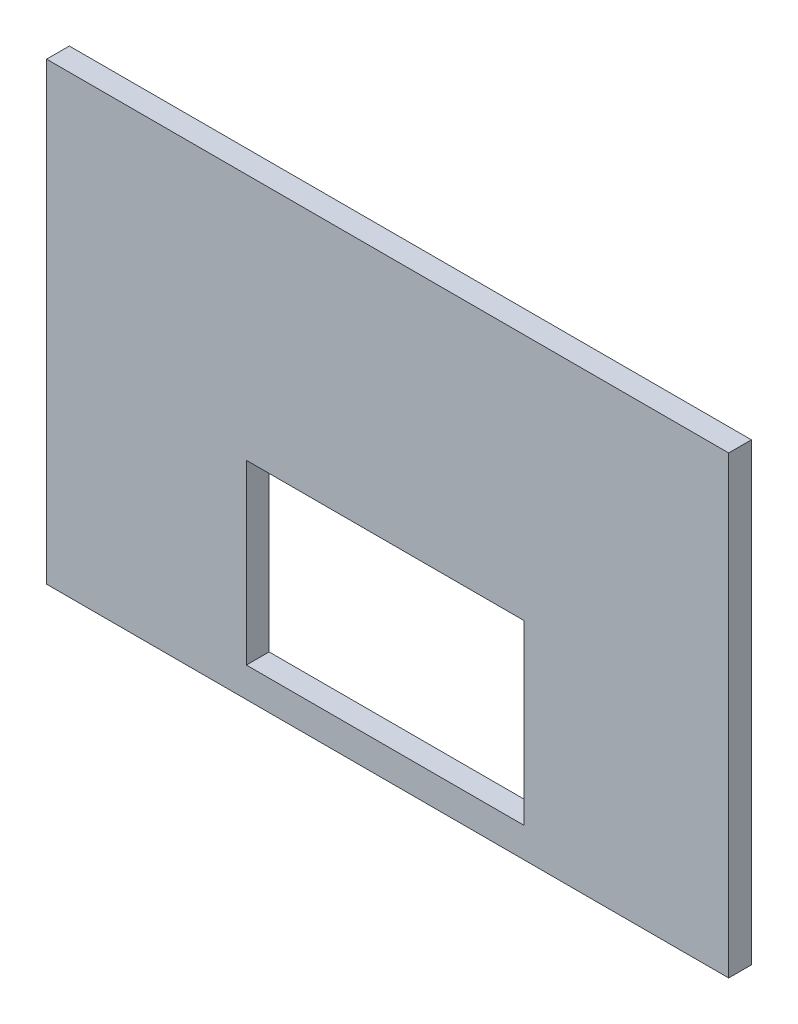
ISO-10303-21;
HEADER;
FILE_DESCRIPTION(('STEP AP214'),'2;1');
FILE_NAME('part.step','',(''),(''),'','','');
FILE_SCHEMA(('AUTOMOTIVE_DESIGN { 1 0 10303 214 1 1 1 1 }'));
ENDSEC;
DATA;
#1=APPLICATION_CONTEXT('core data for automotive mechanical design processes');
#2=APPLICATION_PROTOCOL_DEFINITION('international standard','automotive_design',2000,#1);
#3=PRODUCT_CONTEXT('',#1,'mechanical');
#4=PRODUCT('Part','Part','',(#3));
#5=PRODUCT_RELATED_PRODUCT_CATEGORY('part','',(#4));
#6=PRODUCT_DEFINITION_FORMATION('','',#4);
#7=PRODUCT_DEFINITION_CONTEXT('part definition',#1,'design');
#8=PRODUCT_DEFINITION('design','',#6,#7);
#9=PRODUCT_DEFINITION_SHAPE('','',#8);
#10=(LENGTH_UNIT() NAMED_UNIT(*) SI_UNIT(.MILLI.,.METRE.));
#11=(NAMED_UNIT(*) PLANE_ANGLE_UNIT() SI_UNIT($,.RADIAN.));
#12=(NAMED_UNIT(*) SI_UNIT($,.STERADIAN.) SOLID_ANGLE_UNIT());
#13=UNCERTAINTY_MEASURE_WITH_UNIT(LENGTH_MEASURE(1.E-05),#10,'distance_accuracy_value','');
#14=(GEOMETRIC_REPRESENTATION_CONTEXT(3) GLOBAL_UNCERTAINTY_ASSIGNED_CONTEXT((#13)) GLOBAL_UNIT_ASSIGNED_CONTEXT((#10,
#11,#12)) REPRESENTATION_CONTEXT('',''));
#15=CARTESIAN_POINT('',(0.,0.,0.));
#16=DIRECTION('',(0.,0.,1.));
#17=DIRECTION('',(1.,0.,0.));
#18=AXIS2_PLACEMENT_3D('',#15,#16,#17);
#19=CARTESIAN_POINT('',(0.,0.,10.));
#20=DIRECTION('',(0.,0.,-1.));
#21=DIRECTION('',(-1.,0.,0.));
#22=AXIS2_PLACEMENT_3D('',#19,#20,#21);
#23=PLANE('',#22);
#24=DIRECTION('',(0.,-1.,0.));
#25=VECTOR('',#24,1.);
#26=CARTESIAN_POINT('',(-54.4303797468355,-68.6708860759494,10.));
#27=LINE('',#26,#25);
#28=CARTESIAN_POINT('',(-54.4303797468355,131.329113924051,10.));
#29=VERTEX_POINT('',#28);
#30=CARTESIAN_POINT('',(-54.4303797468355,-68.6708860759494,10.));
#31=VERTEX_POINT('',#30);
#32=EDGE_CURVE('E159',#29,#31,#27,.T.);
#33=ORIENTED_EDGE('',*,*,#32,.T.);
#34=DIRECTION('',(1.,0.,0.));
#35=VECTOR('',#34,1.);
#36=CARTESIAN_POINT('',(-54.4303797468355,-68.6708860759494,10.));
#37=LINE('',#36,#35);
#38=CARTESIAN_POINT('',(245.569620253165,-68.6708860759494,10.));
#39=VERTEX_POINT('',#38);
#40=EDGE_CURVE('E163',#31,#39,#37,.T.);
#41=ORIENTED_EDGE('',*,*,#40,.T.);
#42=DIRECTION('',(0.,1.,0.));
#43=VECTOR('',#42,1.);
#44=CARTESIAN_POINT('',(245.569620253165,-68.6708860759494,10.));
#45=LINE('',#44,#43);
#46=CARTESIAN_POINT('',(245.569620253165,131.329113924051,10.));
#47=VERTEX_POINT('',#46);
#48=EDGE_CURVE('E167',#39,#47,#45,.T.);
#49=ORIENTED_EDGE('',*,*,#48,.T.);
#50=DIRECTION('',(-1.,0.,0.));
#51=VECTOR('',#50,1.);
#52=CARTESIAN_POINT('',(-54.4303797468355,131.329113924051,10.));
#53=LINE('',#52,#51);
#54=EDGE_CURVE('E170',#47,#29,#53,.T.);
#55=ORIENTED_EDGE('',*,*,#54,.T.);
#56=EDGE_LOOP('',(#33,#41,#49,#55));
#57=FACE_BOUND('',#56,.T.);
#58=DIRECTION('',(0.,-1.,0.));
#59=VECTOR('',#58,1.);
#60=CARTESIAN_POINT('',(33.4430379746835,-55.5316455696202,10.));
#61=LINE('',#60,#59);
#62=CARTESIAN_POINT('',(33.4430379746835,22.4683544303798,10.));
#63=VERTEX_POINT('',#62);
#64=CARTESIAN_POINT('',(33.4430379746835,-55.5316455696202,10.));
#65=VERTEX_POINT('',#64);
#66=EDGE_CURVE('E111',#63,#65,#61,.T.);
#67=ORIENTED_EDGE('',*,*,#66,.F.);
#68=DIRECTION('',(-1.,0.,0.));
#69=VECTOR('',#68,1.);
#70=CARTESIAN_POINT('',(33.4430379746835,22.4683544303798,10.));
#71=LINE('',#70,#69);
#72=CARTESIAN_POINT('',(155.443037974684,22.4683544303798,10.));
#73=VERTEX_POINT('',#72);
#74=EDGE_CURVE('E137',#73,#63,#71,.T.);
#75=ORIENTED_EDGE('',*,*,#74,.F.);
#76=DIRECTION('',(0.,1.,0.));
#77=VECTOR('',#76,1.);
#78=CARTESIAN_POINT('',(155.443037974684,-55.5316455696202,10.));
#79=LINE('',#78,#77);
#80=CARTESIAN_POINT('',(155.443037974684,-55.5316455696202,10.));
#81=VERTEX_POINT('',#80);
#82=EDGE_CURVE('E133',#81,#73,#79,.T.);
#83=ORIENTED_EDGE('',*,*,#82,.F.);
#84=DIRECTION('',(1.,0.,0.));
#85=VECTOR('',#84,1.);
#86=CARTESIAN_POINT('',(33.4430379746835,-55.5316455696202,10.));
#87=LINE('',#86,#85);
#88=EDGE_CURVE('E120',#65,#81,#87,.T.);
#89=ORIENTED_EDGE('',*,*,#88,.F.);
#90=EDGE_LOOP('',(#67,#75,#83,#89));
#91=FACE_BOUND('',#90,.T.);
#92=ADVANCED_FACE('F45',(#57,#91),#23,.F.);
#93=CARTESIAN_POINT('',(0.,0.,0.));
#94=DIRECTION('',(0.,0.,-1.));
#95=DIRECTION('',(-1.,0.,0.));
#96=AXIS2_PLACEMENT_3D('',#93,#94,#95);
#97=PLANE('',#96);
#98=DIRECTION('',(0.,-1.,0.));
#99=VECTOR('',#98,1.);
#100=CARTESIAN_POINT('',(-54.4303797468355,-68.6708860759494,0.));
#101=LINE('',#100,#99);
#102=CARTESIAN_POINT('',(-54.4303797468355,131.329113924051,0.));
#103=VERTEX_POINT('',#102);
#104=CARTESIAN_POINT('',(-54.4303797468355,-68.6708860759494,0.));
#105=VERTEX_POINT('',#104);
#106=EDGE_CURVE('E129',#103,#105,#101,.T.);
#107=ORIENTED_EDGE('',*,*,#106,.F.);
#108=DIRECTION('',(-1.,0.,0.));
#109=VECTOR('',#108,1.);
#110=CARTESIAN_POINT('',(-54.4303797468355,131.329113924051,0.));
#111=LINE('',#110,#109);
#112=CARTESIAN_POINT('',(245.569620253165,131.329113924051,0.));
#113=VERTEX_POINT('',#112);
#114=EDGE_CURVE('E164',#113,#103,#111,.T.);
#115=ORIENTED_EDGE('',*,*,#114,.F.);
#116=DIRECTION('',(0.,1.,0.));
#117=VECTOR('',#116,1.);
#118=CARTESIAN_POINT('',(245.569620253165,-68.6708860759494,0.));
#119=LINE('',#118,#117);
#120=CARTESIAN_POINT('',(245.569620253165,-68.6708860759494,0.));
#121=VERTEX_POINT('',#120);
#122=EDGE_CURVE('E180',#121,#113,#119,.T.);
#123=ORIENTED_EDGE('',*,*,#122,.F.);
#124=DIRECTION('',(1.,0.,0.));
#125=VECTOR('',#124,1.);
#126=CARTESIAN_POINT('',(-54.4303797468355,-68.6708860759494,0.));
#127=LINE('',#126,#125);
#128=EDGE_CURVE('E177',#105,#121,#127,.T.);
#129=ORIENTED_EDGE('',*,*,#128,.F.);
#130=EDGE_LOOP('',(#107,#115,#123,#129));
#131=FACE_BOUND('',#130,.T.);
#132=DIRECTION('',(-1.,0.,0.));
#133=VECTOR('',#132,1.);
#134=CARTESIAN_POINT('',(33.4430379746835,22.4683544303798,0.));
#135=LINE('',#134,#133);
#136=CARTESIAN_POINT('',(155.443037974684,22.4683544303798,0.));
#137=VERTEX_POINT('',#136);
#138=CARTESIAN_POINT('',(33.4430379746835,22.4683544303798,0.));
#139=VERTEX_POINT('',#138);
#140=EDGE_CURVE('E121',#137,#139,#135,.T.);
#141=ORIENTED_EDGE('',*,*,#140,.T.);
#142=DIRECTION('',(0.,-1.,0.));
#143=VECTOR('',#142,1.);
#144=CARTESIAN_POINT('',(33.4430379746835,-55.5316455696202,0.));
#145=LINE('',#144,#143);
#146=CARTESIAN_POINT('',(33.4430379746835,-55.5316455696202,0.));
#147=VERTEX_POINT('',#146);
#148=EDGE_CURVE('E69',#139,#147,#145,.T.);
#149=ORIENTED_EDGE('',*,*,#148,.T.);
#150=DIRECTION('',(1.,0.,0.));
#151=VECTOR('',#150,1.);
#152=CARTESIAN_POINT('',(33.4430379746835,-55.5316455696202,0.));
#153=LINE('',#152,#151);
#154=CARTESIAN_POINT('',(155.443037974684,-55.5316455696202,0.));
#155=VERTEX_POINT('',#154);
#156=EDGE_CURVE('E127',#147,#155,#153,.T.);
#157=ORIENTED_EDGE('',*,*,#156,.T.);
#158=DIRECTION('',(0.,1.,0.));
#159=VECTOR('',#158,1.);
#160=CARTESIAN_POINT('',(155.443037974684,-55.5316455696202,0.));
#161=LINE('',#160,#159);
#162=EDGE_CURVE('E146',#155,#137,#161,.T.);
#163=ORIENTED_EDGE('',*,*,#162,.T.);
#164=EDGE_LOOP('',(#141,#149,#157,#163));
#165=FACE_BOUND('',#164,.T.);
#166=ADVANCED_FACE('F203',(#131,#165),#97,.T.);
#167=CARTESIAN_POINT('',(-54.4303797468355,-68.6708860759494,10.));
#168=DIRECTION('',(1.,0.,0.));
#169=DIRECTION('',(0.,1.,0.));
#170=AXIS2_PLACEMENT_3D('',#167,#168,#169);
#171=PLANE('',#170);
#172=ORIENTED_EDGE('',*,*,#106,.T.);
#173=DIRECTION('',(0.,0.,-1.));
#174=VECTOR('',#173,1.);
#175=CARTESIAN_POINT('',(-54.4303797468355,-68.6708860759494,10.));
#176=LINE('',#175,#174);
#177=EDGE_CURVE('E11',#31,#105,#176,.T.);
#178=ORIENTED_EDGE('',*,*,#177,.F.);
#179=ORIENTED_EDGE('',*,*,#32,.F.);
#180=DIRECTION('',(0.,0.,-1.));
#181=VECTOR('',#180,1.);
#182=CARTESIAN_POINT('',(-54.4303797468355,131.329113924051,10.));
#183=LINE('',#182,#181);
#184=EDGE_CURVE('E173',#29,#103,#183,.T.);
#185=ORIENTED_EDGE('',*,*,#184,.T.);
#186=EDGE_LOOP('',(#172,#178,#179,#185));
#187=FACE_BOUND('',#186,.T.);
#188=ADVANCED_FACE('F47',(#187),#171,.F.);
#189=CARTESIAN_POINT('',(-54.4303797468355,-68.6708860759494,10.));
#190=DIRECTION('',(0.,1.,0.));
#191=DIRECTION('',(0.,0.,1.));
#192=AXIS2_PLACEMENT_3D('',#189,#190,#191);
#193=PLANE('',#192);
#194=ORIENTED_EDGE('',*,*,#128,.T.);
#195=DIRECTION('',(0.,0.,-1.));
#196=VECTOR('',#195,1.);
#197=CARTESIAN_POINT('',(245.569620253165,-68.6708860759494,10.));
#198=LINE('',#197,#196);
#199=EDGE_CURVE('E54',#39,#121,#198,.T.);
#200=ORIENTED_EDGE('',*,*,#199,.F.);
#201=ORIENTED_EDGE('',*,*,#40,.F.);
#202=ORIENTED_EDGE('',*,*,#177,.T.);
#203=EDGE_LOOP('',(#194,#200,#201,#202));
#204=FACE_BOUND('',#203,.T.);
#205=ADVANCED_FACE('F213',(#204),#193,.F.);
#206=CARTESIAN_POINT('',(245.569620253165,-68.6708860759494,10.));
#207=DIRECTION('',(-1.,0.,0.));
#208=DIRECTION('',(0.,0.,1.));
#209=AXIS2_PLACEMENT_3D('',#206,#207,#208);
#210=PLANE('',#209);
#211=ORIENTED_EDGE('',*,*,#122,.T.);
#212=DIRECTION('',(0.,0.,-1.));
#213=VECTOR('',#212,1.);
#214=CARTESIAN_POINT('',(245.569620253165,131.329113924051,10.));
#215=LINE('',#214,#213);
#216=EDGE_CURVE('E188',#47,#113,#215,.T.);
#217=ORIENTED_EDGE('',*,*,#216,.F.);
#218=ORIENTED_EDGE('',*,*,#48,.F.);
#219=ORIENTED_EDGE('',*,*,#199,.T.);
#220=EDGE_LOOP('',(#211,#217,#218,#219));
#221=FACE_BOUND('',#220,.T.);
#222=ADVANCED_FACE('F197',(#221),#210,.F.);
#223=CARTESIAN_POINT('',(-54.4303797468355,131.329113924051,10.));
#224=DIRECTION('',(0.,-1.,0.));
#225=DIRECTION('',(0.,0.,-1.));
#226=AXIS2_PLACEMENT_3D('',#223,#224,#225);
#227=PLANE('',#226);
#228=ORIENTED_EDGE('',*,*,#114,.T.);
#229=ORIENTED_EDGE('',*,*,#184,.F.);
#230=ORIENTED_EDGE('',*,*,#54,.F.);
#231=ORIENTED_EDGE('',*,*,#216,.T.);
#232=EDGE_LOOP('',(#228,#229,#230,#231));
#233=FACE_BOUND('',#232,.T.);
#234=ADVANCED_FACE('F207',(#233),#227,.F.);
#235=CARTESIAN_POINT('',(33.4430379746835,-55.5316455696202,10.));
#236=DIRECTION('',(1.,0.,0.));
#237=DIRECTION('',(0.,0.,-1.));
#238=AXIS2_PLACEMENT_3D('',#235,#236,#237);
#239=PLANE('',#238);
#240=ORIENTED_EDGE('',*,*,#148,.F.);
#241=DIRECTION('',(0.,0.,-1.));
#242=VECTOR('',#241,1.);
#243=CARTESIAN_POINT('',(33.4430379746835,22.4683544303798,10.));
#244=LINE('',#243,#242);
#245=EDGE_CURVE('E115',#63,#139,#244,.T.);
#246=ORIENTED_EDGE('',*,*,#245,.F.);
#247=ORIENTED_EDGE('',*,*,#66,.T.);
#248=DIRECTION('',(0.,0.,-1.));
#249=VECTOR('',#248,1.);
#250=CARTESIAN_POINT('',(33.4430379746835,-55.5316455696202,10.));
#251=LINE('',#250,#249);
#252=EDGE_CURVE('E114',#65,#147,#251,.T.);
#253=ORIENTED_EDGE('',*,*,#252,.T.);
#254=EDGE_LOOP('',(#240,#246,#247,#253));
#255=FACE_BOUND('',#254,.T.);
#256=ADVANCED_FACE('F113',(#255),#239,.T.);
#257=CARTESIAN_POINT('',(33.4430379746835,-55.5316455696202,10.));
#258=DIRECTION('',(0.,1.,0.));
#259=DIRECTION('',(0.,0.,1.));
#260=AXIS2_PLACEMENT_3D('',#257,#258,#259);
#261=PLANE('',#260);
#262=ORIENTED_EDGE('',*,*,#156,.F.);
#263=ORIENTED_EDGE('',*,*,#252,.F.);
#264=ORIENTED_EDGE('',*,*,#88,.T.);
#265=DIRECTION('',(0.,0.,-1.));
#266=VECTOR('',#265,1.);
#267=CARTESIAN_POINT('',(155.443037974684,-55.5316455696202,10.));
#268=LINE('',#267,#266);
#269=EDGE_CURVE('E130',#81,#155,#268,.T.);
#270=ORIENTED_EDGE('',*,*,#269,.T.);
#271=EDGE_LOOP('',(#262,#263,#264,#270));
#272=FACE_BOUND('',#271,.T.);
#273=ADVANCED_FACE('F124',(#272),#261,.T.);
#274=CARTESIAN_POINT('',(155.443037974684,-55.5316455696202,10.));
#275=DIRECTION('',(-1.,0.,0.));
#276=DIRECTION('',(0.,0.,1.));
#277=AXIS2_PLACEMENT_3D('',#274,#275,#276);
#278=PLANE('',#277);
#279=ORIENTED_EDGE('',*,*,#162,.F.);
#280=ORIENTED_EDGE('',*,*,#269,.F.);
#281=ORIENTED_EDGE('',*,*,#82,.T.);
#282=DIRECTION('',(0.,0.,-1.));
#283=VECTOR('',#282,1.);
#284=CARTESIAN_POINT('',(155.443037974684,22.4683544303798,10.));
#285=LINE('',#284,#283);
#286=EDGE_CURVE('E61',#73,#137,#285,.T.);
#287=ORIENTED_EDGE('',*,*,#286,.T.);
#288=EDGE_LOOP('',(#279,#280,#281,#287));
#289=FACE_BOUND('',#288,.T.);
#290=ADVANCED_FACE('F236',(#289),#278,.T.);
#291=CARTESIAN_POINT('',(33.4430379746835,22.4683544303798,10.));
#292=DIRECTION('',(0.,-1.,0.));
#293=DIRECTION('',(0.,0.,-1.));
#294=AXIS2_PLACEMENT_3D('',#291,#292,#293);
#295=PLANE('',#294);
#296=ORIENTED_EDGE('',*,*,#140,.F.);
#297=ORIENTED_EDGE('',*,*,#286,.F.);
#298=ORIENTED_EDGE('',*,*,#74,.T.);
#299=ORIENTED_EDGE('',*,*,#245,.T.);
#300=EDGE_LOOP('',(#296,#297,#298,#299));
#301=FACE_BOUND('',#300,.T.);
#302=ADVANCED_FACE('F240',(#301),#295,.T.);
#303=CLOSED_SHELL('',(#92,#166,#188,#205,#222,#234,#256,#273,#290,#302));
#304=MANIFOLD_SOLID_BREP('B2',#303);
#305=ADVANCED_BREP_SHAPE_REPRESENTATION('',(#18,#304),#14);
#306=SHAPE_DEFINITION_REPRESENTATION(#9,#305);
ENDSEC;
END-ISO-10303-21;
